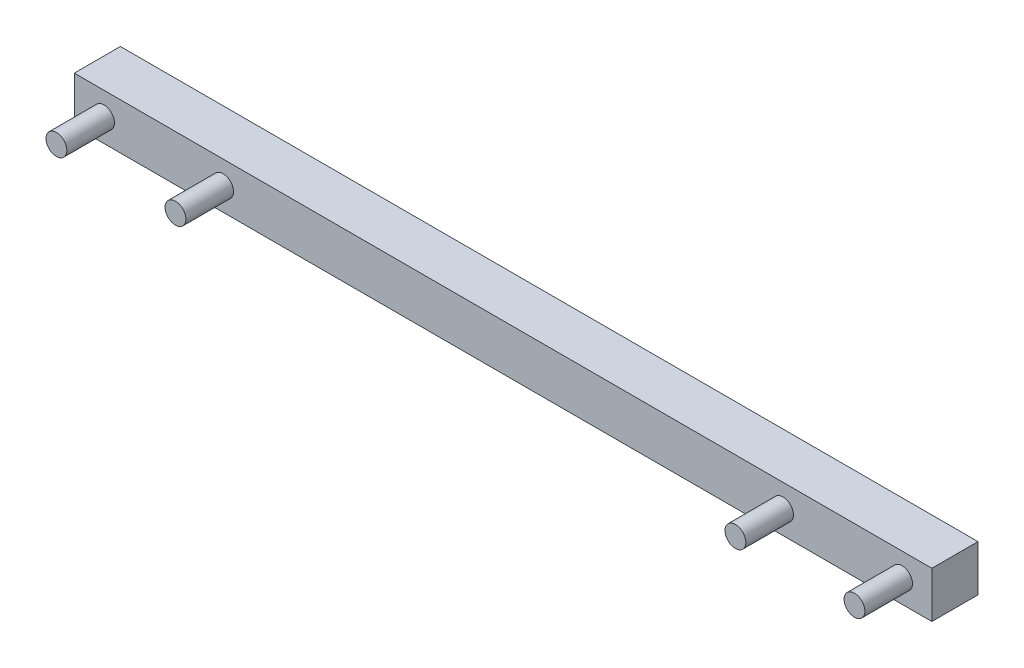
ISO-10303-21;
HEADER;
FILE_DESCRIPTION(('STEP AP214'),'2;1');
FILE_NAME('part.step','',(''),(''),'','','');
FILE_SCHEMA(('AUTOMOTIVE_DESIGN { 1 0 10303 214 1 1 1 1 }'));
ENDSEC;
DATA;
#1=APPLICATION_CONTEXT('core data for automotive mechanical design processes');
#2=APPLICATION_PROTOCOL_DEFINITION('international standard','automotive_design',2000,#1);
#3=PRODUCT_CONTEXT('',#1,'mechanical');
#4=PRODUCT('Part','Part','',(#3));
#5=PRODUCT_RELATED_PRODUCT_CATEGORY('part','',(#4));
#6=PRODUCT_DEFINITION_FORMATION('','',#4);
#7=PRODUCT_DEFINITION_CONTEXT('part definition',#1,'design');
#8=PRODUCT_DEFINITION('design','',#6,#7);
#9=PRODUCT_DEFINITION_SHAPE('','',#8);
#10=(LENGTH_UNIT() NAMED_UNIT(*) SI_UNIT(.MILLI.,.METRE.));
#11=(NAMED_UNIT(*) PLANE_ANGLE_UNIT() SI_UNIT($,.RADIAN.));
#12=(NAMED_UNIT(*) SI_UNIT($,.STERADIAN.) SOLID_ANGLE_UNIT());
#13=UNCERTAINTY_MEASURE_WITH_UNIT(LENGTH_MEASURE(1.E-05),#10,'distance_accuracy_value','');
#14=(GEOMETRIC_REPRESENTATION_CONTEXT(3) GLOBAL_UNCERTAINTY_ASSIGNED_CONTEXT((#13)) GLOBAL_UNIT_ASSIGNED_CONTEXT((#10,
#11,#12)) REPRESENTATION_CONTEXT('',''));
#15=CARTESIAN_POINT('',(0.,0.,0.));
#16=DIRECTION('',(0.,0.,1.));
#17=DIRECTION('',(1.,0.,0.));
#18=AXIS2_PLACEMENT_3D('',#15,#16,#17);
#19=CARTESIAN_POINT('',(-164.,0.,16.));
#20=DIRECTION('',(0.,0.,-1.));
#21=DIRECTION('',(-1.,0.,0.));
#22=AXIS2_PLACEMENT_3D('',#19,#20,#21);
#23=CYLINDRICAL_SURFACE('',#22,3.49999999999999);
#24=CARTESIAN_POINT('',(-164.,0.,16.));
#25=DIRECTION('',(0.,0.,1.));
#26=DIRECTION('',(1.,0.,0.));
#27=AXIS2_PLACEMENT_3D('',#24,#25,#26);
#28=CIRCLE('',#27,3.49999999999999);
#29=CARTESIAN_POINT('',(-160.5,0.,16.));
#30=VERTEX_POINT('',#29);
#31=EDGE_CURVE('E11',#30,#30,#28,.T.);
#32=ORIENTED_EDGE('',*,*,#31,.F.);
#33=EDGE_LOOP('',(#32));
#34=FACE_BOUND('',#33,.T.);
#35=CARTESIAN_POINT('',(-164.,0.,0.));
#36=DIRECTION('',(0.,0.,1.));
#37=DIRECTION('',(1.,0.,0.));
#38=AXIS2_PLACEMENT_3D('',#35,#36,#37);
#39=CIRCLE('',#38,3.49999999999999);
#40=CARTESIAN_POINT('',(-160.5,0.,0.));
#41=VERTEX_POINT('',#40);
#42=EDGE_CURVE('E42',#41,#41,#39,.T.);
#43=ORIENTED_EDGE('',*,*,#42,.T.);
#44=EDGE_LOOP('',(#43));
#45=FACE_BOUND('',#44,.T.);
#46=ADVANCED_FACE('F39',(#34,#45),#23,.T.);
#47=CARTESIAN_POINT('',(-164.,0.,16.));
#48=DIRECTION('',(0.,0.,1.));
#49=DIRECTION('',(1.,0.,0.));
#50=AXIS2_PLACEMENT_3D('',#47,#48,#49);
#51=PLANE('',#50);
#52=ORIENTED_EDGE('',*,*,#31,.T.);
#53=EDGE_LOOP('',(#52));
#54=FACE_BOUND('',#53,.T.);
#55=ADVANCED_FACE('F151',(#54),#51,.T.);
#56=CARTESIAN_POINT('',(-214.,7.75000000000003,-15.5));
#57=DIRECTION('',(1.,0.,0.));
#58=DIRECTION('',(0.,0.,-1.));
#59=AXIS2_PLACEMENT_3D('',#56,#57,#58);
#60=PLANE('',#59);
#61=DIRECTION('',(0.,1.,0.));
#62=VECTOR('',#61,1.);
#63=CARTESIAN_POINT('',(-214.,7.75000000000003,0.));
#64=LINE('',#63,#62);
#65=CARTESIAN_POINT('',(-214.,-7.74999999999997,0.));
#66=VERTEX_POINT('',#65);
#67=CARTESIAN_POINT('',(-214.,7.75000000000003,0.));
#68=VERTEX_POINT('',#67);
#69=EDGE_CURVE('E111',#66,#68,#64,.T.);
#70=ORIENTED_EDGE('',*,*,#69,.T.);
#71=DIRECTION('',(0.,0.,1.));
#72=VECTOR('',#71,1.);
#73=CARTESIAN_POINT('',(-214.,7.75000000000003,-15.5));
#74=LINE('',#73,#72);
#75=CARTESIAN_POINT('',(-214.,7.75000000000003,-15.5));
#76=VERTEX_POINT('',#75);
#77=EDGE_CURVE('E100',#76,#68,#74,.T.);
#78=ORIENTED_EDGE('',*,*,#77,.F.);
#79=DIRECTION('',(0.,1.,0.));
#80=VECTOR('',#79,1.);
#81=CARTESIAN_POINT('',(-214.,7.75000000000003,-15.5));
#82=LINE('',#81,#80);
#83=CARTESIAN_POINT('',(-214.,-7.74999999999997,-15.5));
#84=VERTEX_POINT('',#83);
#85=EDGE_CURVE('E92',#84,#76,#82,.T.);
#86=ORIENTED_EDGE('',*,*,#85,.F.);
#87=DIRECTION('',(0.,0.,1.));
#88=VECTOR('',#87,1.);
#89=CARTESIAN_POINT('',(-214.,-7.74999999999997,-15.5));
#90=LINE('',#89,#88);
#91=EDGE_CURVE('E107',#84,#66,#90,.T.);
#92=ORIENTED_EDGE('',*,*,#91,.T.);
#93=EDGE_LOOP('',(#70,#78,#86,#92));
#94=FACE_BOUND('',#93,.T.);
#95=ADVANCED_FACE('F140',(#94),#60,.F.);
#96=CARTESIAN_POINT('',(-214.,7.75000000000003,-15.5));
#97=DIRECTION('',(0.,-1.,0.));
#98=DIRECTION('',(1.,0.,0.));
#99=AXIS2_PLACEMENT_3D('',#96,#97,#98);
#100=PLANE('',#99);
#101=DIRECTION('',(1.,0.,0.));
#102=VECTOR('',#101,1.);
#103=CARTESIAN_POINT('',(-214.,7.75000000000003,0.));
#104=LINE('',#103,#102);
#105=CARTESIAN_POINT('',(74.1,7.74999999999999,0.));
#106=VERTEX_POINT('',#105);
#107=EDGE_CURVE('E98',#68,#106,#104,.T.);
#108=ORIENTED_EDGE('',*,*,#107,.T.);
#109=DIRECTION('',(0.,0.,1.));
#110=VECTOR('',#109,1.);
#111=CARTESIAN_POINT('',(74.1,7.74999999999999,-15.5));
#112=LINE('',#111,#110);
#113=CARTESIAN_POINT('',(74.1,7.74999999999999,-15.5));
#114=VERTEX_POINT('',#113);
#115=EDGE_CURVE('E96',#114,#106,#112,.T.);
#116=ORIENTED_EDGE('',*,*,#115,.F.);
#117=DIRECTION('',(1.,0.,0.));
#118=VECTOR('',#117,1.);
#119=CARTESIAN_POINT('',(-214.,7.75000000000003,-15.5));
#120=LINE('',#119,#118);
#121=EDGE_CURVE('E87',#76,#114,#120,.T.);
#122=ORIENTED_EDGE('',*,*,#121,.F.);
#123=ORIENTED_EDGE('',*,*,#77,.T.);
#124=EDGE_LOOP('',(#108,#116,#122,#123));
#125=FACE_BOUND('',#124,.T.);
#126=ADVANCED_FACE('F97',(#125),#100,.F.);
#127=CARTESIAN_POINT('',(74.1,7.74999999999999,-15.5));
#128=DIRECTION('',(-1.,0.,0.));
#129=DIRECTION('',(0.,-1.,0.));
#130=AXIS2_PLACEMENT_3D('',#127,#128,#129);
#131=PLANE('',#130);
#132=DIRECTION('',(0.,-1.,0.));
#133=VECTOR('',#132,1.);
#134=CARTESIAN_POINT('',(74.1,7.74999999999999,0.));
#135=LINE('',#134,#133);
#136=CARTESIAN_POINT('',(74.1,-7.75000000000001,0.));
#137=VERTEX_POINT('',#136);
#138=EDGE_CURVE('E73',#106,#137,#135,.T.);
#139=ORIENTED_EDGE('',*,*,#138,.T.);
#140=DIRECTION('',(0.,0.,1.));
#141=VECTOR('',#140,1.);
#142=CARTESIAN_POINT('',(74.1,-7.75000000000001,-15.5));
#143=LINE('',#142,#141);
#144=CARTESIAN_POINT('',(74.1,-7.75000000000001,-15.5));
#145=VERTEX_POINT('',#144);
#146=EDGE_CURVE('E101',#145,#137,#143,.T.);
#147=ORIENTED_EDGE('',*,*,#146,.F.);
#148=DIRECTION('',(0.,-1.,0.));
#149=VECTOR('',#148,1.);
#150=CARTESIAN_POINT('',(74.1,7.74999999999999,-15.5));
#151=LINE('',#150,#149);
#152=EDGE_CURVE('E90',#114,#145,#151,.T.);
#153=ORIENTED_EDGE('',*,*,#152,.F.);
#154=ORIENTED_EDGE('',*,*,#115,.T.);
#155=EDGE_LOOP('',(#139,#147,#153,#154));
#156=FACE_BOUND('',#155,.T.);
#157=ADVANCED_FACE('F103',(#156),#131,.F.);
#158=CARTESIAN_POINT('',(-214.,-7.74999999999997,-15.5));
#159=DIRECTION('',(0.,1.,0.));
#160=DIRECTION('',(-1.,0.,0.));
#161=AXIS2_PLACEMENT_3D('',#158,#159,#160);
#162=PLANE('',#161);
#163=DIRECTION('',(-1.,0.,0.));
#164=VECTOR('',#163,1.);
#165=CARTESIAN_POINT('',(-214.,-7.74999999999997,0.));
#166=LINE('',#165,#164);
#167=EDGE_CURVE('E79',#137,#66,#166,.T.);
#168=ORIENTED_EDGE('',*,*,#167,.T.);
#169=ORIENTED_EDGE('',*,*,#91,.F.);
#170=DIRECTION('',(-1.,0.,0.));
#171=VECTOR('',#170,1.);
#172=CARTESIAN_POINT('',(-214.,-7.74999999999997,-15.5));
#173=LINE('',#172,#171);
#174=EDGE_CURVE('E56',#145,#84,#173,.T.);
#175=ORIENTED_EDGE('',*,*,#174,.F.);
#176=ORIENTED_EDGE('',*,*,#146,.T.);
#177=EDGE_LOOP('',(#168,#169,#175,#176));
#178=FACE_BOUND('',#177,.T.);
#179=ADVANCED_FACE('F141',(#178),#162,.F.);
#180=CARTESIAN_POINT('',(0.,0.,-15.5));
#181=DIRECTION('',(0.,0.,1.));
#182=DIRECTION('',(1.,0.,0.));
#183=AXIS2_PLACEMENT_3D('',#180,#181,#182);
#184=PLANE('',#183);
#185=ORIENTED_EDGE('',*,*,#85,.T.);
#186=ORIENTED_EDGE('',*,*,#121,.T.);
#187=ORIENTED_EDGE('',*,*,#152,.T.);
#188=ORIENTED_EDGE('',*,*,#174,.T.);
#189=EDGE_LOOP('',(#185,#186,#187,#188));
#190=FACE_BOUND('',#189,.T.);
#191=ADVANCED_FACE('F88',(#190),#184,.F.);
#192=CARTESIAN_POINT('',(0.,0.,0.));
#193=DIRECTION('',(0.,0.,1.));
#194=DIRECTION('',(1.,0.,0.));
#195=AXIS2_PLACEMENT_3D('',#192,#193,#194);
#196=PLANE('',#195);
#197=CARTESIAN_POINT('',(64.1,0.,0.));
#198=DIRECTION('',(0.,0.,1.));
#199=DIRECTION('',(1.,0.,0.));
#200=AXIS2_PLACEMENT_3D('',#197,#198,#199);
#201=CIRCLE('',#200,3.49999999999999);
#202=CARTESIAN_POINT('',(67.6,0.,0.));
#203=VERTEX_POINT('',#202);
#204=EDGE_CURVE('E270',#203,#203,#201,.T.);
#205=ORIENTED_EDGE('',*,*,#204,.F.);
#206=EDGE_LOOP('',(#205));
#207=FACE_BOUND('',#206,.T.);
#208=CARTESIAN_POINT('',(-204.,0.,0.));
#209=DIRECTION('',(0.,0.,1.));
#210=DIRECTION('',(1.,0.,0.));
#211=AXIS2_PLACEMENT_3D('',#208,#209,#210);
#212=CIRCLE('',#211,3.49999999999999);
#213=CARTESIAN_POINT('',(-200.5,0.,0.));
#214=VERTEX_POINT('',#213);
#215=EDGE_CURVE('E269',#214,#214,#212,.T.);
#216=ORIENTED_EDGE('',*,*,#215,.F.);
#217=EDGE_LOOP('',(#216));
#218=FACE_BOUND('',#217,.T.);
#219=CARTESIAN_POINT('',(24.1,0.,0.));
#220=DIRECTION('',(0.,0.,1.));
#221=DIRECTION('',(1.,0.,0.));
#222=AXIS2_PLACEMENT_3D('',#219,#220,#221);
#223=CIRCLE('',#222,3.49999999999999);
#224=CARTESIAN_POINT('',(27.6,0.,0.));
#225=VERTEX_POINT('',#224);
#226=EDGE_CURVE('E282',#225,#225,#223,.T.);
#227=ORIENTED_EDGE('',*,*,#226,.F.);
#228=EDGE_LOOP('',(#227));
#229=FACE_BOUND('',#228,.T.);
#230=ORIENTED_EDGE('',*,*,#42,.F.);
#231=EDGE_LOOP('',(#230));
#232=FACE_BOUND('',#231,.T.);
#233=ORIENTED_EDGE('',*,*,#69,.F.);
#234=ORIENTED_EDGE('',*,*,#167,.F.);
#235=ORIENTED_EDGE('',*,*,#138,.F.);
#236=ORIENTED_EDGE('',*,*,#107,.F.);
#237=EDGE_LOOP('',(#233,#234,#235,#236));
#238=FACE_BOUND('',#237,.T.);
#239=ADVANCED_FACE('F132',(#207,#218,#229,#232,#238),#196,.T.);
#240=CARTESIAN_POINT('',(24.1,0.,16.));
#241=DIRECTION('',(0.,0.,-1.));
#242=DIRECTION('',(-1.,0.,0.));
#243=AXIS2_PLACEMENT_3D('',#240,#241,#242);
#244=CYLINDRICAL_SURFACE('',#243,3.49999999999999);
#245=CARTESIAN_POINT('',(24.1,0.,16.));
#246=DIRECTION('',(0.,0.,1.));
#247=DIRECTION('',(1.,0.,0.));
#248=AXIS2_PLACEMENT_3D('',#245,#246,#247);
#249=CIRCLE('',#248,3.49999999999999);
#250=CARTESIAN_POINT('',(27.6,0.,16.));
#251=VERTEX_POINT('',#250);
#252=EDGE_CURVE('E115',#251,#251,#249,.T.);
#253=ORIENTED_EDGE('',*,*,#252,.F.);
#254=EDGE_LOOP('',(#253));
#255=FACE_BOUND('',#254,.T.);
#256=ORIENTED_EDGE('',*,*,#226,.T.);
#257=EDGE_LOOP('',(#256));
#258=FACE_BOUND('',#257,.T.);
#259=ADVANCED_FACE('F135',(#255,#258),#244,.T.);
#260=CARTESIAN_POINT('',(24.1,0.,16.));
#261=DIRECTION('',(0.,0.,1.));
#262=DIRECTION('',(1.,0.,0.));
#263=AXIS2_PLACEMENT_3D('',#260,#261,#262);
#264=PLANE('',#263);
#265=ORIENTED_EDGE('',*,*,#252,.T.);
#266=EDGE_LOOP('',(#265));
#267=FACE_BOUND('',#266,.T.);
#268=ADVANCED_FACE('F197',(#267),#264,.T.);
#269=CARTESIAN_POINT('',(-204.,0.,16.));
#270=DIRECTION('',(0.,0.,-1.));
#271=DIRECTION('',(-1.,0.,0.));
#272=AXIS2_PLACEMENT_3D('',#269,#270,#271);
#273=CYLINDRICAL_SURFACE('',#272,3.49999999999999);
#274=CARTESIAN_POINT('',(-204.,0.,16.));
#275=DIRECTION('',(0.,0.,1.));
#276=DIRECTION('',(1.,0.,0.));
#277=AXIS2_PLACEMENT_3D('',#274,#275,#276);
#278=CIRCLE('',#277,3.49999999999999);
#279=CARTESIAN_POINT('',(-200.5,0.,16.));
#280=VERTEX_POINT('',#279);
#281=EDGE_CURVE('E275',#280,#280,#278,.T.);
#282=ORIENTED_EDGE('',*,*,#281,.F.);
#283=EDGE_LOOP('',(#282));
#284=FACE_BOUND('',#283,.T.);
#285=ORIENTED_EDGE('',*,*,#215,.T.);
#286=EDGE_LOOP('',(#285));
#287=FACE_BOUND('',#286,.T.);
#288=ADVANCED_FACE('F208',(#284,#287),#273,.T.);
#289=CARTESIAN_POINT('',(-204.,0.,16.));
#290=DIRECTION('',(0.,0.,1.));
#291=DIRECTION('',(1.,0.,0.));
#292=AXIS2_PLACEMENT_3D('',#289,#290,#291);
#293=PLANE('',#292);
#294=ORIENTED_EDGE('',*,*,#281,.T.);
#295=EDGE_LOOP('',(#294));
#296=FACE_BOUND('',#295,.T.);
#297=ADVANCED_FACE('F218',(#296),#293,.T.);
#298=CARTESIAN_POINT('',(64.1,0.,16.));
#299=DIRECTION('',(0.,0.,-1.));
#300=DIRECTION('',(-1.,0.,0.));
#301=AXIS2_PLACEMENT_3D('',#298,#299,#300);
#302=CYLINDRICAL_SURFACE('',#301,3.49999999999999);
#303=CARTESIAN_POINT('',(64.1,0.,16.));
#304=DIRECTION('',(0.,0.,1.));
#305=DIRECTION('',(1.,0.,0.));
#306=AXIS2_PLACEMENT_3D('',#303,#304,#305);
#307=CIRCLE('',#306,3.49999999999999);
#308=CARTESIAN_POINT('',(67.6,0.,16.));
#309=VERTEX_POINT('',#308);
#310=EDGE_CURVE('E267',#309,#309,#307,.T.);
#311=ORIENTED_EDGE('',*,*,#310,.F.);
#312=EDGE_LOOP('',(#311));
#313=FACE_BOUND('',#312,.T.);
#314=ORIENTED_EDGE('',*,*,#204,.T.);
#315=EDGE_LOOP('',(#314));
#316=FACE_BOUND('',#315,.T.);
#317=ADVANCED_FACE('F228',(#313,#316),#302,.T.);
#318=CARTESIAN_POINT('',(64.1,0.,16.));
#319=DIRECTION('',(0.,0.,1.));
#320=DIRECTION('',(1.,0.,0.));
#321=AXIS2_PLACEMENT_3D('',#318,#319,#320);
#322=PLANE('',#321);
#323=ORIENTED_EDGE('',*,*,#310,.T.);
#324=EDGE_LOOP('',(#323));
#325=FACE_BOUND('',#324,.T.);
#326=ADVANCED_FACE('F238',(#325),#322,.T.);
#327=CLOSED_SHELL('',(#46,#55,#95,#126,#157,#179,#191,#239,#259,#268,#288,#297,#317,#326));
#328=MANIFOLD_SOLID_BREP('B2',#327);
#329=ADVANCED_BREP_SHAPE_REPRESENTATION('',(#18,#328),#14);
#330=SHAPE_DEFINITION_REPRESENTATION(#9,#329);
ENDSEC;
END-ISO-10303-21;
